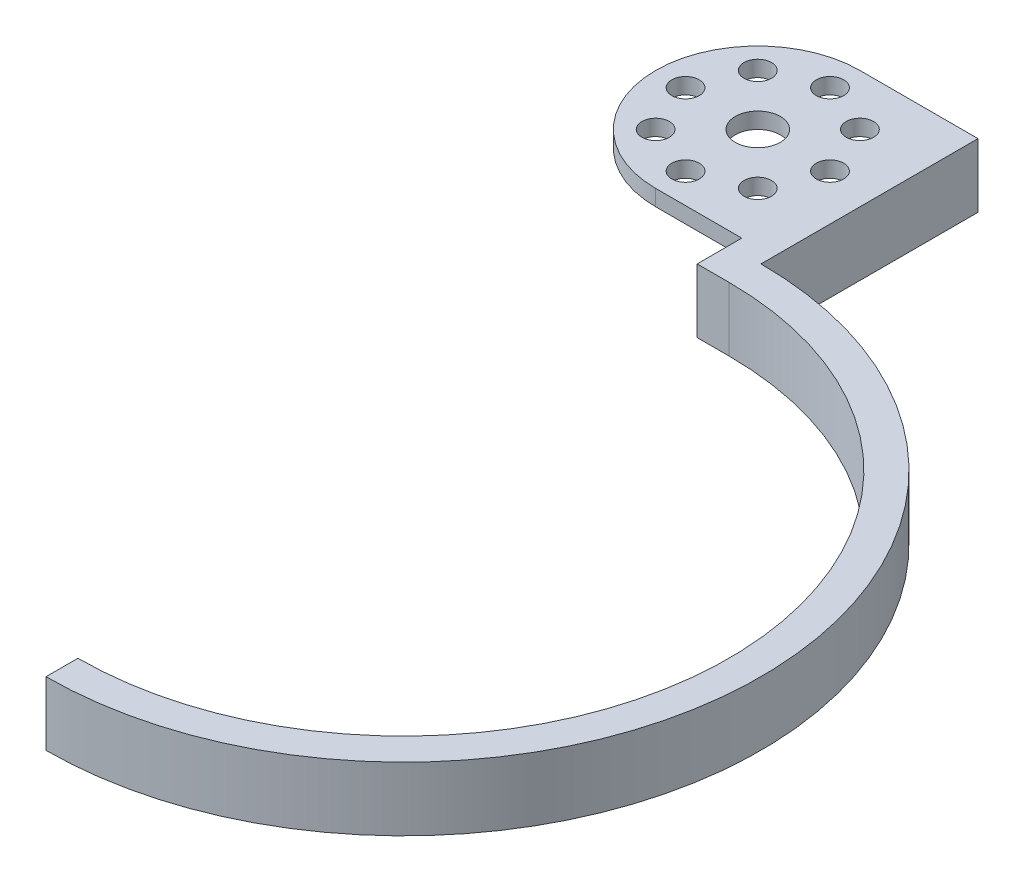
ISO-10303-21;
HEADER;
FILE_DESCRIPTION(('STEP AP214'),'2;1');
FILE_NAME('part.step','',(''),(''),'','','');
FILE_SCHEMA(('AUTOMOTIVE_DESIGN { 1 0 10303 214 1 1 1 1 }'));
ENDSEC;
DATA;
#1=APPLICATION_CONTEXT('core data for automotive mechanical design processes');
#2=APPLICATION_PROTOCOL_DEFINITION('international standard','automotive_design',2000,#1);
#3=PRODUCT_CONTEXT('',#1,'mechanical');
#4=PRODUCT('Part','Part','',(#3));
#5=PRODUCT_RELATED_PRODUCT_CATEGORY('part','',(#4));
#6=PRODUCT_DEFINITION_FORMATION('','',#4);
#7=PRODUCT_DEFINITION_CONTEXT('part definition',#1,'design');
#8=PRODUCT_DEFINITION('design','',#6,#7);
#9=PRODUCT_DEFINITION_SHAPE('','',#8);
#10=(LENGTH_UNIT() NAMED_UNIT(*) SI_UNIT(.MILLI.,.METRE.));
#11=(NAMED_UNIT(*) PLANE_ANGLE_UNIT() SI_UNIT($,.RADIAN.));
#12=(NAMED_UNIT(*) SI_UNIT($,.STERADIAN.) SOLID_ANGLE_UNIT());
#13=UNCERTAINTY_MEASURE_WITH_UNIT(LENGTH_MEASURE(1.E-05),#10,'distance_accuracy_value','');
#14=(GEOMETRIC_REPRESENTATION_CONTEXT(3) GLOBAL_UNCERTAINTY_ASSIGNED_CONTEXT((#13)) GLOBAL_UNIT_ASSIGNED_CONTEXT((#10,
#11,#12)) REPRESENTATION_CONTEXT('',''));
#15=CARTESIAN_POINT('',(0.,0.,0.));
#16=DIRECTION('',(0.,0.,1.));
#17=DIRECTION('',(1.,0.,0.));
#18=AXIS2_PLACEMENT_3D('',#15,#16,#17);
#19=CARTESIAN_POINT('',(0.,0.,0.));
#20=DIRECTION('',(0.,1.,0.));
#21=DIRECTION('',(0.,0.,1.));
#22=AXIS2_PLACEMENT_3D('',#19,#20,#21);
#23=PLANE('',#22);
#24=CARTESIAN_POINT('',(1.76013011315404,0.,58.2407623233474));
#25=DIRECTION('',(0.,1.,0.));
#26=DIRECTION('',(0.,0.,1.));
#27=AXIS2_PLACEMENT_3D('',#24,#25,#26);
#28=CIRCLE('',#27,2.15);
#29=CARTESIAN_POINT('',(1.76013011315404,0.,60.3907623233474));
#30=VERTEX_POINT('',#29);
#31=EDGE_CURVE('E170',#30,#30,#28,.T.);
#32=ORIENTED_EDGE('',*,*,#31,.T.);
#33=EDGE_LOOP('',(#32));
#34=FACE_BOUND('',#33,.T.);
#35=CARTESIAN_POINT('',(9.76013011315404,0.,54.9270538243626));
#36=DIRECTION('',(0.,1.,0.));
#37=DIRECTION('',(0.,0.,1.));
#38=AXIS2_PLACEMENT_3D('',#35,#36,#37);
#39=CIRCLE('',#38,2.15);
#40=CARTESIAN_POINT('',(9.76013011315404,0.,57.0770538243626));
#41=VERTEX_POINT('',#40);
#42=EDGE_CURVE('E167',#41,#41,#39,.T.);
#43=ORIENTED_EDGE('',*,*,#42,.T.);
#44=EDGE_LOOP('',(#43));
#45=FACE_BOUND('',#44,.T.);
#46=CARTESIAN_POINT('',(13.0738386121388,0.,46.9270538243626));
#47=DIRECTION('',(0.,1.,0.));
#48=DIRECTION('',(0.,0.,1.));
#49=AXIS2_PLACEMENT_3D('',#46,#47,#48);
#50=CIRCLE('',#49,2.15);
#51=CARTESIAN_POINT('',(13.0738386121388,0.,49.0770538243626));
#52=VERTEX_POINT('',#51);
#53=EDGE_CURVE('E174',#52,#52,#50,.T.);
#54=ORIENTED_EDGE('',*,*,#53,.T.);
#55=EDGE_LOOP('',(#54));
#56=FACE_BOUND('',#55,.T.);
#57=CARTESIAN_POINT('',(9.76013011315407,0.,38.9270538243626));
#58=DIRECTION('',(0.,1.,0.));
#59=DIRECTION('',(0.,0.,1.));
#60=AXIS2_PLACEMENT_3D('',#57,#58,#59);
#61=CIRCLE('',#60,2.15);
#62=CARTESIAN_POINT('',(9.76013011315407,0.,41.0770538243626));
#63=VERTEX_POINT('',#62);
#64=EDGE_CURVE('E180',#63,#63,#61,.T.);
#65=ORIENTED_EDGE('',*,*,#64,.T.);
#66=EDGE_LOOP('',(#65));
#67=FACE_BOUND('',#66,.T.);
#68=CARTESIAN_POINT('',(1.76013011315407,0.,35.6133453253778));
#69=DIRECTION('',(0.,1.,0.));
#70=DIRECTION('',(0.,0.,1.));
#71=AXIS2_PLACEMENT_3D('',#68,#69,#70);
#72=CIRCLE('',#71,2.15);
#73=CARTESIAN_POINT('',(1.76013011315407,0.,37.7633453253778));
#74=VERTEX_POINT('',#73);
#75=EDGE_CURVE('E186',#74,#74,#72,.T.);
#76=ORIENTED_EDGE('',*,*,#75,.T.);
#77=EDGE_LOOP('',(#76));
#78=FACE_BOUND('',#77,.T.);
#79=CARTESIAN_POINT('',(-9.55357838583071,0.,46.9270538243626));
#80=DIRECTION('',(0.,1.,0.));
#81=DIRECTION('',(0.,0.,1.));
#82=AXIS2_PLACEMENT_3D('',#79,#80,#81);
#83=CIRCLE('',#82,2.15);
#84=CARTESIAN_POINT('',(-9.55357838583071,0.,49.0770538243626));
#85=VERTEX_POINT('',#84);
#86=EDGE_CURVE('E192',#85,#85,#83,.T.);
#87=ORIENTED_EDGE('',*,*,#86,.T.);
#88=EDGE_LOOP('',(#87));
#89=FACE_BOUND('',#88,.T.);
#90=CARTESIAN_POINT('',(-6.23986988684597,0.,54.9270538243626));
#91=DIRECTION('',(0.,1.,0.));
#92=DIRECTION('',(0.,0.,1.));
#93=AXIS2_PLACEMENT_3D('',#90,#91,#92);
#94=CIRCLE('',#93,2.15);
#95=CARTESIAN_POINT('',(-6.23986988684597,0.,57.0770538243626));
#96=VERTEX_POINT('',#95);
#97=EDGE_CURVE('E198',#96,#96,#94,.T.);
#98=ORIENTED_EDGE('',*,*,#97,.T.);
#99=EDGE_LOOP('',(#98));
#100=FACE_BOUND('',#99,.T.);
#101=CARTESIAN_POINT('',(-6.23986988684594,0.,38.9270538243626));
#102=DIRECTION('',(0.,1.,0.));
#103=DIRECTION('',(0.,0.,1.));
#104=AXIS2_PLACEMENT_3D('',#101,#102,#103);
#105=CIRCLE('',#104,2.15);
#106=CARTESIAN_POINT('',(-6.23986988684594,0.,41.0770538243626));
#107=VERTEX_POINT('',#106);
#108=EDGE_CURVE('E204',#107,#107,#105,.T.);
#109=ORIENTED_EDGE('',*,*,#108,.T.);
#110=EDGE_LOOP('',(#109));
#111=FACE_BOUND('',#110,.T.);
#112=CARTESIAN_POINT('',(1.76013011315407,0.,46.9270538243626));
#113=DIRECTION('',(0.,1.,0.));
#114=DIRECTION('',(0.,0.,1.));
#115=AXIS2_PLACEMENT_3D('',#112,#113,#114);
#116=CIRCLE('',#115,3.525);
#117=CARTESIAN_POINT('',(1.76013011315407,0.,50.4520538243626));
#118=VERTEX_POINT('',#117);
#119=EDGE_CURVE('E156',#118,#118,#116,.T.);
#120=ORIENTED_EDGE('',*,*,#119,.T.);
#121=EDGE_LOOP('',(#120));
#122=FACE_BOUND('',#121,.T.);
#123=DIRECTION('',(0.,0.,-1.));
#124=VECTOR('',#123,1.);
#125=CARTESIAN_POINT('',(15.2601301131541,0.,30.9270538243626));
#126=LINE('',#125,#124);
#127=CARTESIAN_POINT('',(15.2601301131541,0.,62.9270538243626));
#128=VERTEX_POINT('',#127);
#129=CARTESIAN_POINT('',(15.2601301131541,0.,30.9270538243626));
#130=VERTEX_POINT('',#129);
#131=EDGE_CURVE('E127',#128,#130,#126,.T.);
#132=ORIENTED_EDGE('',*,*,#131,.F.);
#133=DIRECTION('',(1.,0.,0.));
#134=VECTOR('',#133,1.);
#135=CARTESIAN_POINT('',(1.76013011315407,0.,62.9270538243626));
#136=LINE('',#135,#134);
#137=CARTESIAN_POINT('',(1.76013011315407,0.,62.9270538243626));
#138=VERTEX_POINT('',#137);
#139=EDGE_CURVE('E232',#138,#128,#136,.T.);
#140=ORIENTED_EDGE('',*,*,#139,.F.);
#141=CARTESIAN_POINT('',(1.76013011315407,0.,46.9270538243626));
#142=DIRECTION('',(0.,1.,0.));
#143=DIRECTION('',(0.,0.,1.));
#144=AXIS2_PLACEMENT_3D('',#141,#142,#143);
#145=CIRCLE('',#144,16.);
#146=CARTESIAN_POINT('',(1.76013011315407,0.,30.9270538243626));
#147=VERTEX_POINT('',#146);
#148=EDGE_CURVE('E225',#147,#138,#145,.T.);
#149=ORIENTED_EDGE('',*,*,#148,.F.);
#150=DIRECTION('',(-1.,0.,0.));
#151=VECTOR('',#150,1.);
#152=CARTESIAN_POINT('',(1.76013011315407,0.,30.9270538243626));
#153=LINE('',#152,#151);
#154=EDGE_CURVE('E49',#130,#147,#153,.T.);
#155=ORIENTED_EDGE('',*,*,#154,.F.);
#156=EDGE_LOOP('',(#132,#140,#149,#155));
#157=FACE_BOUND('',#156,.T.);
#158=ADVANCED_FACE('F34',(#34,#45,#56,#67,#78,#89,#100,#111,#122,#157),#23,.F.);
#159=CARTESIAN_POINT('',(1.76013011315407,2.5,62.9270538243626));
#160=DIRECTION('',(0.,0.,-1.));
#161=DIRECTION('',(-1.,0.,0.));
#162=AXIS2_PLACEMENT_3D('',#159,#160,#161);
#163=PLANE('',#162);
#164=ORIENTED_EDGE('',*,*,#139,.T.);
#165=DIRECTION('',(0.,1.,0.));
#166=VECTOR('',#165,1.);
#167=CARTESIAN_POINT('',(15.2601301131541,-7.5,62.9270538243626));
#168=LINE('',#167,#166);
#169=CARTESIAN_POINT('',(15.2601301131541,2.5,62.9270538243626));
#170=VERTEX_POINT('',#169);
#171=EDGE_CURVE('E57',#128,#170,#168,.T.);
#172=ORIENTED_EDGE('',*,*,#171,.T.);
#173=DIRECTION('',(1.,0.,0.));
#174=VECTOR('',#173,1.);
#175=CARTESIAN_POINT('',(1.76013011315407,2.5,62.9270538243626));
#176=LINE('',#175,#174);
#177=CARTESIAN_POINT('',(1.76013011315407,2.5,62.9270538243626));
#178=VERTEX_POINT('',#177);
#179=EDGE_CURVE('E235',#178,#170,#176,.T.);
#180=ORIENTED_EDGE('',*,*,#179,.F.);
#181=DIRECTION('',(0.,-1.,0.));
#182=VECTOR('',#181,1.);
#183=CARTESIAN_POINT('',(1.76013011315407,2.5,62.9270538243626));
#184=LINE('',#183,#182);
#185=EDGE_CURVE('E11',#178,#138,#184,.T.);
#186=ORIENTED_EDGE('',*,*,#185,.T.);
#187=EDGE_LOOP('',(#164,#172,#180,#186));
#188=FACE_BOUND('',#187,.T.);
#189=ADVANCED_FACE('F36',(#188),#163,.F.);
#190=CARTESIAN_POINT('',(20.2601301131541,2.5,30.9270538243626));
#191=DIRECTION('',(-1.,0.,0.));
#192=DIRECTION('',(0.,0.,1.));
#193=AXIS2_PLACEMENT_3D('',#190,#191,#192);
#194=PLANE('',#193);
#195=DIRECTION('',(0.,0.,1.));
#196=VECTOR('',#195,1.);
#197=CARTESIAN_POINT('',(20.2601301131541,-7.5,62.9270538243626));
#198=LINE('',#197,#196);
#199=CARTESIAN_POINT('',(20.2601301131541,-7.5,30.9270538243626));
#200=VERTEX_POINT('',#199);
#201=CARTESIAN_POINT('',(20.2601301131541,-7.5,64.9270538243626));
#202=VERTEX_POINT('',#201);
#203=EDGE_CURVE('E220',#200,#202,#198,.T.);
#204=ORIENTED_EDGE('',*,*,#203,.F.);
#205=DIRECTION('',(0.,-1.,0.));
#206=VECTOR('',#205,1.);
#207=CARTESIAN_POINT('',(20.2601301131541,2.5,30.9270538243626));
#208=LINE('',#207,#206);
#209=CARTESIAN_POINT('',(20.2601301131541,2.5,30.9270538243626));
#210=VERTEX_POINT('',#209);
#211=EDGE_CURVE('E42',#210,#200,#208,.T.);
#212=ORIENTED_EDGE('',*,*,#211,.F.);
#213=DIRECTION('',(0.,0.,-1.));
#214=VECTOR('',#213,1.);
#215=CARTESIAN_POINT('',(20.2601301131541,2.5,30.9270538243626));
#216=LINE('',#215,#214);
#217=CARTESIAN_POINT('',(20.2601301131541,2.5,64.9270538243626));
#218=VERTEX_POINT('',#217);
#219=EDGE_CURVE('E237',#218,#210,#216,.T.);
#220=ORIENTED_EDGE('',*,*,#219,.F.);
#221=DIRECTION('',(0.,-1.,0.));
#222=VECTOR('',#221,1.);
#223=CARTESIAN_POINT('',(20.2601301131541,2.5,64.9270538243626));
#224=LINE('',#223,#222);
#225=EDGE_CURVE('E147',#218,#202,#224,.T.);
#226=ORIENTED_EDGE('',*,*,#225,.T.);
#227=EDGE_LOOP('',(#204,#212,#220,#226));
#228=FACE_BOUND('',#227,.T.);
#229=ADVANCED_FACE('F257',(#228),#194,.F.);
#230=CARTESIAN_POINT('',(1.76013011315407,2.5,30.9270538243626));
#231=DIRECTION('',(0.,0.,1.));
#232=DIRECTION('',(1.,0.,0.));
#233=AXIS2_PLACEMENT_3D('',#230,#231,#232);
#234=PLANE('',#233);
#235=ORIENTED_EDGE('',*,*,#211,.T.);
#236=DIRECTION('',(1.,0.,0.));
#237=VECTOR('',#236,1.);
#238=CARTESIAN_POINT('',(20.2601301131541,-7.5,30.9270538243626));
#239=LINE('',#238,#237);
#240=CARTESIAN_POINT('',(15.2601301131541,-7.5,30.9270538243626));
#241=VERTEX_POINT('',#240);
#242=EDGE_CURVE('E117',#241,#200,#239,.T.);
#243=ORIENTED_EDGE('',*,*,#242,.F.);
#244=DIRECTION('',(0.,1.,0.));
#245=VECTOR('',#244,1.);
#246=CARTESIAN_POINT('',(15.2601301131541,-7.5,30.9270538243626));
#247=LINE('',#246,#245);
#248=EDGE_CURVE('E125',#241,#130,#247,.T.);
#249=ORIENTED_EDGE('',*,*,#248,.T.);
#250=ORIENTED_EDGE('',*,*,#154,.T.);
#251=DIRECTION('',(0.,-1.,0.));
#252=VECTOR('',#251,1.);
#253=CARTESIAN_POINT('',(1.76013011315407,2.5,30.9270538243626));
#254=LINE('',#253,#252);
#255=CARTESIAN_POINT('',(1.76013011315407,2.5,30.9270538243626));
#256=VERTEX_POINT('',#255);
#257=EDGE_CURVE('E241',#256,#147,#254,.T.);
#258=ORIENTED_EDGE('',*,*,#257,.F.);
#259=DIRECTION('',(-1.,0.,0.));
#260=VECTOR('',#259,1.);
#261=CARTESIAN_POINT('',(1.76013011315407,2.5,30.9270538243626));
#262=LINE('',#261,#260);
#263=EDGE_CURVE('E239',#210,#256,#262,.T.);
#264=ORIENTED_EDGE('',*,*,#263,.F.);
#265=EDGE_LOOP('',(#235,#243,#249,#250,#258,#264));
#266=FACE_BOUND('',#265,.T.);
#267=ADVANCED_FACE('F131',(#266),#234,.F.);
#268=CARTESIAN_POINT('',(0.,2.5,0.));
#269=DIRECTION('',(0.,1.,0.));
#270=DIRECTION('',(0.,0.,1.));
#271=AXIS2_PLACEMENT_3D('',#268,#269,#270);
#272=PLANE('',#271);
#273=CARTESIAN_POINT('',(1.76013011315407,2.5,46.9270538243626));
#274=DIRECTION('',(0.,1.,0.));
#275=DIRECTION('',(0.,0.,1.));
#276=AXIS2_PLACEMENT_3D('',#273,#274,#275);
#277=CIRCLE('',#276,3.525);
#278=CARTESIAN_POINT('',(1.76013011315407,2.5,50.4520538243626));
#279=VERTEX_POINT('',#278);
#280=EDGE_CURVE('E161',#279,#279,#277,.T.);
#281=ORIENTED_EDGE('',*,*,#280,.F.);
#282=EDGE_LOOP('',(#281));
#283=FACE_BOUND('',#282,.T.);
#284=CARTESIAN_POINT('',(-6.23986988684594,2.5,38.9270538243626));
#285=DIRECTION('',(0.,1.,0.));
#286=DIRECTION('',(0.,0.,1.));
#287=AXIS2_PLACEMENT_3D('',#284,#285,#286);
#288=CIRCLE('',#287,2.15);
#289=CARTESIAN_POINT('',(-6.23986988684594,2.5,41.0770538243626));
#290=VERTEX_POINT('',#289);
#291=EDGE_CURVE('E164',#290,#290,#288,.T.);
#292=ORIENTED_EDGE('',*,*,#291,.F.);
#293=EDGE_LOOP('',(#292));
#294=FACE_BOUND('',#293,.T.);
#295=CARTESIAN_POINT('',(-6.23986988684597,2.5,54.9270538243626));
#296=DIRECTION('',(0.,1.,0.));
#297=DIRECTION('',(0.,0.,1.));
#298=AXIS2_PLACEMENT_3D('',#295,#296,#297);
#299=CIRCLE('',#298,2.15);
#300=CARTESIAN_POINT('',(-6.23986988684597,2.5,57.0770538243626));
#301=VERTEX_POINT('',#300);
#302=EDGE_CURVE('E201',#301,#301,#299,.T.);
#303=ORIENTED_EDGE('',*,*,#302,.F.);
#304=EDGE_LOOP('',(#303));
#305=FACE_BOUND('',#304,.T.);
#306=CARTESIAN_POINT('',(-9.55357838583071,2.5,46.9270538243626));
#307=DIRECTION('',(0.,1.,0.));
#308=DIRECTION('',(0.,0.,1.));
#309=AXIS2_PLACEMENT_3D('',#306,#307,#308);
#310=CIRCLE('',#309,2.15);
#311=CARTESIAN_POINT('',(-9.55357838583071,2.5,49.0770538243626));
#312=VERTEX_POINT('',#311);
#313=EDGE_CURVE('E195',#312,#312,#310,.T.);
#314=ORIENTED_EDGE('',*,*,#313,.F.);
#315=EDGE_LOOP('',(#314));
#316=FACE_BOUND('',#315,.T.);
#317=CARTESIAN_POINT('',(1.76013011315407,2.5,35.6133453253778));
#318=DIRECTION('',(0.,1.,0.));
#319=DIRECTION('',(0.,0.,1.));
#320=AXIS2_PLACEMENT_3D('',#317,#318,#319);
#321=CIRCLE('',#320,2.15);
#322=CARTESIAN_POINT('',(1.76013011315407,2.5,37.7633453253778));
#323=VERTEX_POINT('',#322);
#324=EDGE_CURVE('E189',#323,#323,#321,.T.);
#325=ORIENTED_EDGE('',*,*,#324,.F.);
#326=EDGE_LOOP('',(#325));
#327=FACE_BOUND('',#326,.T.);
#328=CARTESIAN_POINT('',(9.76013011315407,2.5,38.9270538243626));
#329=DIRECTION('',(0.,1.,0.));
#330=DIRECTION('',(0.,0.,1.));
#331=AXIS2_PLACEMENT_3D('',#328,#329,#330);
#332=CIRCLE('',#331,2.15);
#333=CARTESIAN_POINT('',(9.76013011315407,2.5,41.0770538243626));
#334=VERTEX_POINT('',#333);
#335=EDGE_CURVE('E183',#334,#334,#332,.T.);
#336=ORIENTED_EDGE('',*,*,#335,.F.);
#337=EDGE_LOOP('',(#336));
#338=FACE_BOUND('',#337,.T.);
#339=CARTESIAN_POINT('',(13.0738386121388,2.5,46.9270538243626));
#340=DIRECTION('',(0.,1.,0.));
#341=DIRECTION('',(0.,0.,1.));
#342=AXIS2_PLACEMENT_3D('',#339,#340,#341);
#343=CIRCLE('',#342,2.15);
#344=CARTESIAN_POINT('',(13.0738386121388,2.5,49.0770538243626));
#345=VERTEX_POINT('',#344);
#346=EDGE_CURVE('E177',#345,#345,#343,.T.);
#347=ORIENTED_EDGE('',*,*,#346,.F.);
#348=EDGE_LOOP('',(#347));
#349=FACE_BOUND('',#348,.T.);
#350=CARTESIAN_POINT('',(9.76013011315404,2.5,54.9270538243626));
#351=DIRECTION('',(0.,1.,0.));
#352=DIRECTION('',(0.,0.,1.));
#353=AXIS2_PLACEMENT_3D('',#350,#351,#352);
#354=CIRCLE('',#353,2.15);
#355=CARTESIAN_POINT('',(9.76013011315404,2.5,57.0770538243626));
#356=VERTEX_POINT('',#355);
#357=EDGE_CURVE('E171',#356,#356,#354,.T.);
#358=ORIENTED_EDGE('',*,*,#357,.F.);
#359=EDGE_LOOP('',(#358));
#360=FACE_BOUND('',#359,.T.);
#361=CARTESIAN_POINT('',(1.76013011315404,2.5,58.2407623233474));
#362=DIRECTION('',(0.,1.,0.));
#363=DIRECTION('',(0.,0.,1.));
#364=AXIS2_PLACEMENT_3D('',#361,#362,#363);
#365=CIRCLE('',#364,2.15);
#366=CARTESIAN_POINT('',(1.76013011315404,2.5,60.3907623233474));
#367=VERTEX_POINT('',#366);
#368=EDGE_CURVE('E209',#367,#367,#365,.T.);
#369=ORIENTED_EDGE('',*,*,#368,.F.);
#370=EDGE_LOOP('',(#369));
#371=FACE_BOUND('',#370,.T.);
#372=ORIENTED_EDGE('',*,*,#263,.T.);
#373=CARTESIAN_POINT('',(1.76013011315407,2.5,46.9270538243626));
#374=DIRECTION('',(0.,1.,0.));
#375=DIRECTION('',(0.,0.,1.));
#376=AXIS2_PLACEMENT_3D('',#373,#374,#375);
#377=CIRCLE('',#376,16.);
#378=EDGE_CURVE('E229',#256,#178,#377,.T.);
#379=ORIENTED_EDGE('',*,*,#378,.T.);
#380=ORIENTED_EDGE('',*,*,#179,.T.);
#381=DIRECTION('',(0.,0.,1.));
#382=VECTOR('',#381,1.);
#383=CARTESIAN_POINT('',(15.2601301131541,2.5,62.9270538243626));
#384=LINE('',#383,#382);
#385=CARTESIAN_POINT('',(15.2601301131541,2.5,69.9270538243626));
#386=VERTEX_POINT('',#385);
#387=EDGE_CURVE('E212',#170,#386,#384,.T.);
#388=ORIENTED_EDGE('',*,*,#387,.T.);
#389=DIRECTION('',(-1.,0.,0.));
#390=VECTOR('',#389,1.);
#391=CARTESIAN_POINT('',(20.2601301131541,2.5,69.9270538243626));
#392=LINE('',#391,#390);
#393=CARTESIAN_POINT('',(20.2601301131541,2.5,69.9270538243626));
#394=VERTEX_POINT('',#393);
#395=EDGE_CURVE('E122',#394,#386,#392,.T.);
#396=ORIENTED_EDGE('',*,*,#395,.F.);
#397=CARTESIAN_POINT('',(20.2601301131541,2.5,120.927053824363));
#398=DIRECTION('',(0.,1.,0.));
#399=DIRECTION('',(0.,0.,-1.));
#400=AXIS2_PLACEMENT_3D('',#397,#398,#399);
#401=CIRCLE('',#400,51.);
#402=CARTESIAN_POINT('',(20.2601301131541,2.5,171.927053824363));
#403=VERTEX_POINT('',#402);
#404=EDGE_CURVE('E138',#403,#394,#401,.T.);
#405=ORIENTED_EDGE('',*,*,#404,.F.);
#406=DIRECTION('',(0.,0.,-1.));
#407=VECTOR('',#406,1.);
#408=CARTESIAN_POINT('',(20.2601301131541,2.5,171.927053824363));
#409=LINE('',#408,#407);
#410=CARTESIAN_POINT('',(20.2601301131541,2.5,176.927053824363));
#411=VERTEX_POINT('',#410);
#412=EDGE_CURVE('E144',#411,#403,#409,.T.);
#413=ORIENTED_EDGE('',*,*,#412,.F.);
#414=CARTESIAN_POINT('',(20.2601301131541,2.5,120.927053824363));
#415=DIRECTION('',(0.,-1.,0.));
#416=DIRECTION('',(0.,0.,-1.));
#417=AXIS2_PLACEMENT_3D('',#414,#415,#416);
#418=CIRCLE('',#417,56.);
#419=EDGE_CURVE('E140',#218,#411,#418,.T.);
#420=ORIENTED_EDGE('',*,*,#419,.F.);
#421=ORIENTED_EDGE('',*,*,#219,.T.);
#422=EDGE_LOOP('',(#372,#379,#380,#388,#396,#405,#413,#420,#421));
#423=FACE_BOUND('',#422,.T.);
#424=ADVANCED_FACE('F251',(#283,#294,#305,#316,#327,#338,#349,#360,#371,#423),#272,.T.);
#425=CARTESIAN_POINT('',(1.76013011315407,2.5,46.9270538243626));
#426=DIRECTION('',(0.,-1.,0.));
#427=DIRECTION('',(0.,0.,-1.));
#428=AXIS2_PLACEMENT_3D('',#425,#426,#427);
#429=CYLINDRICAL_SURFACE('',#428,16.);
#430=ORIENTED_EDGE('',*,*,#148,.T.);
#431=ORIENTED_EDGE('',*,*,#185,.F.);
#432=ORIENTED_EDGE('',*,*,#378,.F.);
#433=ORIENTED_EDGE('',*,*,#257,.T.);
#434=EDGE_LOOP('',(#430,#431,#432,#433));
#435=FACE_BOUND('',#434,.T.);
#436=ADVANCED_FACE('F248',(#435),#429,.T.);
#437=CARTESIAN_POINT('',(20.2601301131541,-7.5,69.9270538243626));
#438=DIRECTION('',(0.,0.,-1.));
#439=DIRECTION('',(-1.,0.,0.));
#440=AXIS2_PLACEMENT_3D('',#437,#438,#439);
#441=PLANE('',#440);
#442=DIRECTION('',(0.,1.,0.));
#443=VECTOR('',#442,1.);
#444=CARTESIAN_POINT('',(20.2601301131541,-7.5,69.9270538243626));
#445=LINE('',#444,#443);
#446=CARTESIAN_POINT('',(20.2601301131541,-7.5,69.9270538243626));
#447=VERTEX_POINT('',#446);
#448=EDGE_CURVE('E222',#447,#394,#445,.T.);
#449=ORIENTED_EDGE('',*,*,#448,.T.);
#450=ORIENTED_EDGE('',*,*,#395,.T.);
#451=DIRECTION('',(0.,1.,0.));
#452=VECTOR('',#451,1.);
#453=CARTESIAN_POINT('',(15.2601301131541,-7.5,69.9270538243626));
#454=LINE('',#453,#452);
#455=CARTESIAN_POINT('',(15.2601301131541,-7.5,69.9270538243626));
#456=VERTEX_POINT('',#455);
#457=EDGE_CURVE('E226',#456,#386,#454,.T.);
#458=ORIENTED_EDGE('',*,*,#457,.F.);
#459=DIRECTION('',(-1.,0.,0.));
#460=VECTOR('',#459,1.);
#461=CARTESIAN_POINT('',(20.2601301131541,-7.5,69.9270538243626));
#462=LINE('',#461,#460);
#463=EDGE_CURVE('E119',#447,#456,#462,.T.);
#464=ORIENTED_EDGE('',*,*,#463,.F.);
#465=EDGE_LOOP('',(#449,#450,#458,#464));
#466=FACE_BOUND('',#465,.T.);
#467=ADVANCED_FACE('F269',(#466),#441,.F.);
#468=CARTESIAN_POINT('',(15.2601301131541,-7.5,62.9270538243626));
#469=DIRECTION('',(-1.,0.,0.));
#470=DIRECTION('',(0.,0.,1.));
#471=AXIS2_PLACEMENT_3D('',#468,#469,#470);
#472=PLANE('',#471);
#473=ORIENTED_EDGE('',*,*,#457,.T.);
#474=ORIENTED_EDGE('',*,*,#387,.F.);
#475=ORIENTED_EDGE('',*,*,#171,.F.);
#476=ORIENTED_EDGE('',*,*,#131,.T.);
#477=ORIENTED_EDGE('',*,*,#248,.F.);
#478=DIRECTION('',(0.,0.,1.));
#479=VECTOR('',#478,1.);
#480=CARTESIAN_POINT('',(15.2601301131541,-7.5,62.9270538243626));
#481=LINE('',#480,#479);
#482=EDGE_CURVE('E112',#241,#456,#481,.T.);
#483=ORIENTED_EDGE('',*,*,#482,.T.);
#484=EDGE_LOOP('',(#473,#474,#475,#476,#477,#483));
#485=FACE_BOUND('',#484,.T.);
#486=ADVANCED_FACE('F126',(#485),#472,.T.);
#487=CARTESIAN_POINT('',(0.,-7.5,0.));
#488=DIRECTION('',(0.,1.,0.));
#489=DIRECTION('',(0.,0.,1.));
#490=AXIS2_PLACEMENT_3D('',#487,#488,#489);
#491=PLANE('',#490);
#492=ORIENTED_EDGE('',*,*,#482,.F.);
#493=ORIENTED_EDGE('',*,*,#242,.T.);
#494=ORIENTED_EDGE('',*,*,#203,.T.);
#495=CARTESIAN_POINT('',(20.2601301131541,-7.5,120.927053824363));
#496=DIRECTION('',(0.,-1.,0.));
#497=DIRECTION('',(0.,0.,-1.));
#498=AXIS2_PLACEMENT_3D('',#495,#496,#497);
#499=CIRCLE('',#498,56.);
#500=CARTESIAN_POINT('',(20.2601301131541,-7.5,176.927053824363));
#501=VERTEX_POINT('',#500);
#502=EDGE_CURVE('E149',#202,#501,#499,.T.);
#503=ORIENTED_EDGE('',*,*,#502,.T.);
#504=DIRECTION('',(0.,0.,-1.));
#505=VECTOR('',#504,1.);
#506=CARTESIAN_POINT('',(20.2601301131541,-7.5,171.927053824363));
#507=LINE('',#506,#505);
#508=CARTESIAN_POINT('',(20.2601301131541,-7.5,171.927053824363));
#509=VERTEX_POINT('',#508);
#510=EDGE_CURVE('E141',#501,#509,#507,.T.);
#511=ORIENTED_EDGE('',*,*,#510,.T.);
#512=CARTESIAN_POINT('',(20.2601301131541,-7.5,120.927053824363));
#513=DIRECTION('',(0.,1.,0.));
#514=DIRECTION('',(0.,0.,-1.));
#515=AXIS2_PLACEMENT_3D('',#512,#513,#514);
#516=CIRCLE('',#515,51.);
#517=EDGE_CURVE('E129',#509,#447,#516,.T.);
#518=ORIENTED_EDGE('',*,*,#517,.T.);
#519=ORIENTED_EDGE('',*,*,#463,.T.);
#520=EDGE_LOOP('',(#492,#493,#494,#503,#511,#518,#519));
#521=FACE_BOUND('',#520,.T.);
#522=ADVANCED_FACE('F114',(#521),#491,.F.);
#523=CARTESIAN_POINT('',(1.76013011315404,2.5,58.2407623233474));
#524=DIRECTION('',(0.,-1.,0.));
#525=DIRECTION('',(0.,0.,-1.));
#526=AXIS2_PLACEMENT_3D('',#523,#524,#525);
#527=CYLINDRICAL_SURFACE('',#526,2.15);
#528=ORIENTED_EDGE('',*,*,#368,.T.);
#529=EDGE_LOOP('',(#528));
#530=FACE_BOUND('',#529,.T.);
#531=ORIENTED_EDGE('',*,*,#31,.F.);
#532=EDGE_LOOP('',(#531));
#533=FACE_BOUND('',#532,.T.);
#534=ADVANCED_FACE('F317',(#530,#533),#527,.F.);
#535=CARTESIAN_POINT('',(9.76013011315404,2.5,54.9270538243626));
#536=DIRECTION('',(0.,-1.,0.));
#537=DIRECTION('',(0.,0.,-1.));
#538=AXIS2_PLACEMENT_3D('',#535,#536,#537);
#539=CYLINDRICAL_SURFACE('',#538,2.15);
#540=ORIENTED_EDGE('',*,*,#357,.T.);
#541=EDGE_LOOP('',(#540));
#542=FACE_BOUND('',#541,.T.);
#543=ORIENTED_EDGE('',*,*,#42,.F.);
#544=EDGE_LOOP('',(#543));
#545=FACE_BOUND('',#544,.T.);
#546=ADVANCED_FACE('F322',(#542,#545),#539,.F.);
#547=CARTESIAN_POINT('',(13.0738386121388,2.5,46.9270538243626));
#548=DIRECTION('',(0.,-1.,0.));
#549=DIRECTION('',(0.,0.,-1.));
#550=AXIS2_PLACEMENT_3D('',#547,#548,#549);
#551=CYLINDRICAL_SURFACE('',#550,2.15);
#552=ORIENTED_EDGE('',*,*,#346,.T.);
#553=EDGE_LOOP('',(#552));
#554=FACE_BOUND('',#553,.T.);
#555=ORIENTED_EDGE('',*,*,#53,.F.);
#556=EDGE_LOOP('',(#555));
#557=FACE_BOUND('',#556,.T.);
#558=ADVANCED_FACE('F334',(#554,#557),#551,.F.);
#559=CARTESIAN_POINT('',(9.76013011315407,2.5,38.9270538243626));
#560=DIRECTION('',(0.,-1.,0.));
#561=DIRECTION('',(0.,0.,-1.));
#562=AXIS2_PLACEMENT_3D('',#559,#560,#561);
#563=CYLINDRICAL_SURFACE('',#562,2.15);
#564=ORIENTED_EDGE('',*,*,#335,.T.);
#565=EDGE_LOOP('',(#564));
#566=FACE_BOUND('',#565,.T.);
#567=ORIENTED_EDGE('',*,*,#64,.F.);
#568=EDGE_LOOP('',(#567));
#569=FACE_BOUND('',#568,.T.);
#570=ADVANCED_FACE('F344',(#566,#569),#563,.F.);
#571=CARTESIAN_POINT('',(1.76013011315407,2.5,35.6133453253778));
#572=DIRECTION('',(0.,-1.,0.));
#573=DIRECTION('',(0.,0.,-1.));
#574=AXIS2_PLACEMENT_3D('',#571,#572,#573);
#575=CYLINDRICAL_SURFACE('',#574,2.15);
#576=ORIENTED_EDGE('',*,*,#324,.T.);
#577=EDGE_LOOP('',(#576));
#578=FACE_BOUND('',#577,.T.);
#579=ORIENTED_EDGE('',*,*,#75,.F.);
#580=EDGE_LOOP('',(#579));
#581=FACE_BOUND('',#580,.T.);
#582=ADVANCED_FACE('F354',(#578,#581),#575,.F.);
#583=CARTESIAN_POINT('',(-9.55357838583071,2.5,46.9270538243626));
#584=DIRECTION('',(0.,-1.,0.));
#585=DIRECTION('',(0.,0.,-1.));
#586=AXIS2_PLACEMENT_3D('',#583,#584,#585);
#587=CYLINDRICAL_SURFACE('',#586,2.15);
#588=ORIENTED_EDGE('',*,*,#313,.T.);
#589=EDGE_LOOP('',(#588));
#590=FACE_BOUND('',#589,.T.);
#591=ORIENTED_EDGE('',*,*,#86,.F.);
#592=EDGE_LOOP('',(#591));
#593=FACE_BOUND('',#592,.T.);
#594=ADVANCED_FACE('F364',(#590,#593),#587,.F.);
#595=CARTESIAN_POINT('',(-6.23986988684597,2.5,54.9270538243626));
#596=DIRECTION('',(0.,-1.,0.));
#597=DIRECTION('',(0.,0.,-1.));
#598=AXIS2_PLACEMENT_3D('',#595,#596,#597);
#599=CYLINDRICAL_SURFACE('',#598,2.15);
#600=ORIENTED_EDGE('',*,*,#302,.T.);
#601=EDGE_LOOP('',(#600));
#602=FACE_BOUND('',#601,.T.);
#603=ORIENTED_EDGE('',*,*,#97,.F.);
#604=EDGE_LOOP('',(#603));
#605=FACE_BOUND('',#604,.T.);
#606=ADVANCED_FACE('F374',(#602,#605),#599,.F.);
#607=CARTESIAN_POINT('',(-6.23986988684594,2.5,38.9270538243626));
#608=DIRECTION('',(0.,-1.,0.));
#609=DIRECTION('',(0.,0.,-1.));
#610=AXIS2_PLACEMENT_3D('',#607,#608,#609);
#611=CYLINDRICAL_SURFACE('',#610,2.15);
#612=ORIENTED_EDGE('',*,*,#291,.T.);
#613=EDGE_LOOP('',(#612));
#614=FACE_BOUND('',#613,.T.);
#615=ORIENTED_EDGE('',*,*,#108,.F.);
#616=EDGE_LOOP('',(#615));
#617=FACE_BOUND('',#616,.T.);
#618=ADVANCED_FACE('F384',(#614,#617),#611,.F.);
#619=CARTESIAN_POINT('',(1.76013011315407,2.5,46.9270538243626));
#620=DIRECTION('',(0.,-1.,0.));
#621=DIRECTION('',(0.,0.,-1.));
#622=AXIS2_PLACEMENT_3D('',#619,#620,#621);
#623=CYLINDRICAL_SURFACE('',#622,3.525);
#624=ORIENTED_EDGE('',*,*,#280,.T.);
#625=EDGE_LOOP('',(#624));
#626=FACE_BOUND('',#625,.T.);
#627=ORIENTED_EDGE('',*,*,#119,.F.);
#628=EDGE_LOOP('',(#627));
#629=FACE_BOUND('',#628,.T.);
#630=ADVANCED_FACE('F393',(#626,#629),#623,.F.);
#631=CARTESIAN_POINT('',(20.2601301131541,2.5,120.927053824363));
#632=DIRECTION('',(0.,-1.,0.));
#633=DIRECTION('',(0.,0.,-1.));
#634=AXIS2_PLACEMENT_3D('',#631,#632,#633);
#635=CYLINDRICAL_SURFACE('',#634,51.);
#636=ORIENTED_EDGE('',*,*,#517,.F.);
#637=DIRECTION('',(0.,-1.,0.));
#638=VECTOR('',#637,1.);
#639=CARTESIAN_POINT('',(20.2601301131541,2.5,171.927053824363));
#640=LINE('',#639,#638);
#641=EDGE_CURVE('E154',#403,#509,#640,.T.);
#642=ORIENTED_EDGE('',*,*,#641,.F.);
#643=ORIENTED_EDGE('',*,*,#404,.T.);
#644=ORIENTED_EDGE('',*,*,#448,.F.);
#645=EDGE_LOOP('',(#636,#642,#643,#644));
#646=FACE_BOUND('',#645,.T.);
#647=ADVANCED_FACE('F266',(#646),#635,.F.);
#648=CARTESIAN_POINT('',(20.2601301131541,2.5,171.927053824363));
#649=DIRECTION('',(-1.,0.,0.));
#650=DIRECTION('',(0.,0.,1.));
#651=AXIS2_PLACEMENT_3D('',#648,#649,#650);
#652=PLANE('',#651);
#653=ORIENTED_EDGE('',*,*,#510,.F.);
#654=DIRECTION('',(0.,-1.,0.));
#655=VECTOR('',#654,1.);
#656=CARTESIAN_POINT('',(20.2601301131541,2.5,176.927053824363));
#657=LINE('',#656,#655);
#658=EDGE_CURVE('E157',#411,#501,#657,.T.);
#659=ORIENTED_EDGE('',*,*,#658,.F.);
#660=ORIENTED_EDGE('',*,*,#412,.T.);
#661=ORIENTED_EDGE('',*,*,#641,.T.);
#662=EDGE_LOOP('',(#653,#659,#660,#661));
#663=FACE_BOUND('',#662,.T.);
#664=ADVANCED_FACE('F261',(#663),#652,.T.);
#665=CARTESIAN_POINT('',(20.2601301131541,2.5,120.927053824363));
#666=DIRECTION('',(0.,-1.,0.));
#667=DIRECTION('',(0.,0.,-1.));
#668=AXIS2_PLACEMENT_3D('',#665,#666,#667);
#669=CYLINDRICAL_SURFACE('',#668,56.);
#670=ORIENTED_EDGE('',*,*,#502,.F.);
#671=ORIENTED_EDGE('',*,*,#225,.F.);
#672=ORIENTED_EDGE('',*,*,#419,.T.);
#673=ORIENTED_EDGE('',*,*,#658,.T.);
#674=EDGE_LOOP('',(#670,#671,#672,#673));
#675=FACE_BOUND('',#674,.T.);
#676=ADVANCED_FACE('F417',(#675),#669,.T.);
#677=CLOSED_SHELL('',(#158,#189,#229,#267,#424,#436,#467,#486,#522,#534,#546,#558,#570,#582,
#594,#606,#618,#630,#647,#664,#676));
#678=MANIFOLD_SOLID_BREP('B2',#677);
#679=ADVANCED_BREP_SHAPE_REPRESENTATION('',(#18,#678),#14);
#680=SHAPE_DEFINITION_REPRESENTATION(#9,#679);
ENDSEC;
END-ISO-10303-21;
